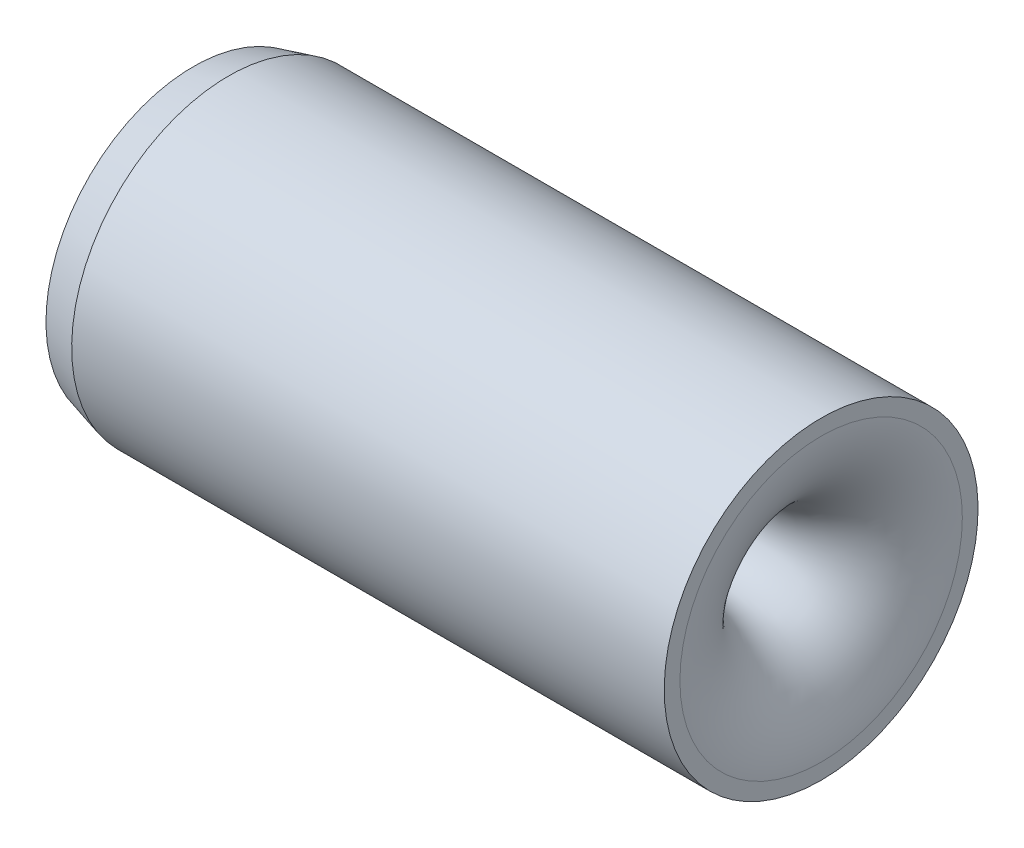
ISO-10303-21;
HEADER;
FILE_DESCRIPTION(('STEP AP214'),'2;1');
FILE_NAME('part.step','',(''),(''),'','','');
FILE_SCHEMA(('AUTOMOTIVE_DESIGN { 1 0 10303 214 1 1 1 1 }'));
ENDSEC;
DATA;
#1=APPLICATION_CONTEXT('core data for automotive mechanical design processes');
#2=APPLICATION_PROTOCOL_DEFINITION('international standard','automotive_design',2000,#1);
#3=PRODUCT_CONTEXT('',#1,'mechanical');
#4=PRODUCT('Part','Part','',(#3));
#5=PRODUCT_RELATED_PRODUCT_CATEGORY('part','',(#4));
#6=PRODUCT_DEFINITION_FORMATION('','',#4);
#7=PRODUCT_DEFINITION_CONTEXT('part definition',#1,'design');
#8=PRODUCT_DEFINITION('design','',#6,#7);
#9=PRODUCT_DEFINITION_SHAPE('','',#8);
#10=(LENGTH_UNIT() NAMED_UNIT(*) SI_UNIT(.MILLI.,.METRE.));
#11=(NAMED_UNIT(*) PLANE_ANGLE_UNIT() SI_UNIT($,.RADIAN.));
#12=(NAMED_UNIT(*) SI_UNIT($,.STERADIAN.) SOLID_ANGLE_UNIT());
#13=UNCERTAINTY_MEASURE_WITH_UNIT(LENGTH_MEASURE(1.E-05),#10,'distance_accuracy_value','');
#14=(GEOMETRIC_REPRESENTATION_CONTEXT(3) GLOBAL_UNCERTAINTY_ASSIGNED_CONTEXT((#13)) GLOBAL_UNIT_ASSIGNED_CONTEXT((#10,
#11,#12)) REPRESENTATION_CONTEXT('',''));
#15=CARTESIAN_POINT('',(0.,0.,0.));
#16=DIRECTION('',(0.,0.,1.));
#17=DIRECTION('',(1.,0.,0.));
#18=AXIS2_PLACEMENT_3D('',#15,#16,#17);
#19=CARTESIAN_POINT('',(2.,0.,0.));
#20=DIRECTION('',(-1.,0.,0.));
#21=DIRECTION('',(0.,-1.,0.));
#22=AXIS2_PLACEMENT_3D('',#19,#20,#21);
#23=TOROIDAL_SURFACE('',#22,1.35,1.);
#24=CARTESIAN_POINT('',(3.,0.,0.));
#25=DIRECTION('',(-1.,0.,0.));
#26=DIRECTION('',(0.,-1.,0.));
#27=AXIS2_PLACEMENT_3D('',#24,#25,#26);
#28=CIRCLE('',#27,1.35);
#29=CARTESIAN_POINT('',(3.,-1.35,0.));
#30=VERTEX_POINT('',#29);
#31=EDGE_CURVE('E10',#30,#30,#28,.T.);
#32=ORIENTED_EDGE('',*,*,#31,.F.);
#33=EDGE_LOOP('',(#32));
#34=FACE_BOUND('',#33,.T.);
#35=CARTESIAN_POINT('',(2.,0.,0.));
#36=DIRECTION('',(-1.,0.,0.));
#37=DIRECTION('',(0.,-1.,0.));
#38=AXIS2_PLACEMENT_3D('',#35,#36,#37);
#39=CIRCLE('',#38,0.349999999999999);
#40=CARTESIAN_POINT('',(2.,-0.349999999999998,0.));
#41=VERTEX_POINT('',#40);
#42=EDGE_CURVE('E56',#41,#41,#39,.T.);
#43=ORIENTED_EDGE('',*,*,#42,.T.);
#44=EDGE_LOOP('',(#43));
#45=FACE_BOUND('',#44,.T.);
#46=ADVANCED_FACE('F31',(#34,#45),#23,.T.);
#47=CARTESIAN_POINT('',(3.,1.5,0.));
#48=DIRECTION('',(-1.,0.,0.));
#49=DIRECTION('',(0.,-1.,0.));
#50=AXIS2_PLACEMENT_3D('',#47,#48,#49);
#51=PLANE('',#50);
#52=CARTESIAN_POINT('',(3.,0.,0.));
#53=DIRECTION('',(-1.,0.,0.));
#54=DIRECTION('',(0.,-1.,0.));
#55=AXIS2_PLACEMENT_3D('',#52,#53,#54);
#56=CIRCLE('',#55,1.5);
#57=CARTESIAN_POINT('',(3.,-1.5,0.));
#58=VERTEX_POINT('',#57);
#59=EDGE_CURVE('E37',#58,#58,#56,.T.);
#60=ORIENTED_EDGE('',*,*,#59,.F.);
#61=EDGE_LOOP('',(#60));
#62=FACE_BOUND('',#61,.T.);
#63=ORIENTED_EDGE('',*,*,#31,.T.);
#64=EDGE_LOOP('',(#63));
#65=FACE_BOUND('',#64,.T.);
#66=ADVANCED_FACE('F87',(#62,#65),#51,.F.);
#67=CARTESIAN_POINT('',(-3.,0.,0.));
#68=DIRECTION('',(-1.,0.,0.));
#69=DIRECTION('',(0.,-1.,0.));
#70=AXIS2_PLACEMENT_3D('',#67,#68,#69);
#71=CYLINDRICAL_SURFACE('',#70,1.5);
#72=CARTESIAN_POINT('',(-2.6641154273188,0.,0.));
#73=DIRECTION('',(-1.,0.,0.));
#74=DIRECTION('',(0.,-1.,0.));
#75=AXIS2_PLACEMENT_3D('',#72,#73,#74);
#76=CIRCLE('',#75,1.5);
#77=CARTESIAN_POINT('',(-2.6641154273188,-1.5,0.));
#78=VERTEX_POINT('',#77);
#79=EDGE_CURVE('E41',#78,#78,#76,.T.);
#80=ORIENTED_EDGE('',*,*,#79,.F.);
#81=EDGE_LOOP('',(#80));
#82=FACE_BOUND('',#81,.T.);
#83=ORIENTED_EDGE('',*,*,#59,.T.);
#84=EDGE_LOOP('',(#83));
#85=FACE_BOUND('',#84,.T.);
#86=ADVANCED_FACE('F82',(#82,#85),#71,.T.);
#87=CARTESIAN_POINT('',(-2.6641154273188,0.,0.));
#88=DIRECTION('',(1.,0.,0.));
#89=DIRECTION('',(0.,1.,0.));
#90=AXIS2_PLACEMENT_3D('',#87,#88,#89);
#91=CONICAL_SURFACE('',#90,1.5,0.26179938779915);
#92=CARTESIAN_POINT('',(-3.,0.,0.));
#93=DIRECTION('',(-1.,0.,0.));
#94=DIRECTION('',(0.,-1.,0.));
#95=AXIS2_PLACEMENT_3D('',#92,#93,#94);
#96=CIRCLE('',#95,1.41);
#97=CARTESIAN_POINT('',(-3.,-1.41,0.));
#98=VERTEX_POINT('',#97);
#99=EDGE_CURVE('E45',#98,#98,#96,.T.);
#100=ORIENTED_EDGE('',*,*,#99,.F.);
#101=EDGE_LOOP('',(#100));
#102=FACE_BOUND('',#101,.T.);
#103=ORIENTED_EDGE('',*,*,#79,.T.);
#104=EDGE_LOOP('',(#103));
#105=FACE_BOUND('',#104,.T.);
#106=ADVANCED_FACE('F76',(#102,#105),#91,.T.);
#107=CARTESIAN_POINT('',(-3.,1.41,0.));
#108=DIRECTION('',(1.,0.,0.));
#109=DIRECTION('',(0.,1.,0.));
#110=AXIS2_PLACEMENT_3D('',#107,#108,#109);
#111=PLANE('',#110);
#112=CARTESIAN_POINT('',(-3.,0.,0.));
#113=DIRECTION('',(-1.,0.,0.));
#114=DIRECTION('',(0.,-1.,0.));
#115=AXIS2_PLACEMENT_3D('',#112,#113,#114);
#116=CIRCLE('',#115,1.35);
#117=CARTESIAN_POINT('',(-3.,-1.35,0.));
#118=VERTEX_POINT('',#117);
#119=EDGE_CURVE('E50',#118,#118,#116,.T.);
#120=ORIENTED_EDGE('',*,*,#119,.F.);
#121=EDGE_LOOP('',(#120));
#122=FACE_BOUND('',#121,.T.);
#123=ORIENTED_EDGE('',*,*,#99,.T.);
#124=EDGE_LOOP('',(#123));
#125=FACE_BOUND('',#124,.T.);
#126=ADVANCED_FACE('F70',(#122,#125),#111,.F.);
#127=CARTESIAN_POINT('',(-2.,0.,0.));
#128=DIRECTION('',(-1.,0.,0.));
#129=DIRECTION('',(0.,-1.,0.));
#130=AXIS2_PLACEMENT_3D('',#127,#128,#129);
#131=TOROIDAL_SURFACE('',#130,1.35,1.);
#132=CARTESIAN_POINT('',(-2.,0.,0.));
#133=DIRECTION('',(-1.,0.,0.));
#134=DIRECTION('',(0.,-1.,0.));
#135=AXIS2_PLACEMENT_3D('',#132,#133,#134);
#136=CIRCLE('',#135,0.35);
#137=CARTESIAN_POINT('',(-2.,-0.35,0.));
#138=VERTEX_POINT('',#137);
#139=EDGE_CURVE('E53',#138,#138,#136,.T.);
#140=ORIENTED_EDGE('',*,*,#139,.F.);
#141=EDGE_LOOP('',(#140));
#142=FACE_BOUND('',#141,.T.);
#143=ORIENTED_EDGE('',*,*,#119,.T.);
#144=EDGE_LOOP('',(#143));
#145=FACE_BOUND('',#144,.T.);
#146=ADVANCED_FACE('F64',(#142,#145),#131,.T.);
#147=CARTESIAN_POINT('',(-3.,0.,0.));
#148=DIRECTION('',(-1.,0.,0.));
#149=DIRECTION('',(0.,-1.,0.));
#150=AXIS2_PLACEMENT_3D('',#147,#148,#149);
#151=CYLINDRICAL_SURFACE('',#150,0.35);
#152=ORIENTED_EDGE('',*,*,#42,.F.);
#153=EDGE_LOOP('',(#152));
#154=FACE_BOUND('',#153,.T.);
#155=ORIENTED_EDGE('',*,*,#139,.T.);
#156=EDGE_LOOP('',(#155));
#157=FACE_BOUND('',#156,.T.);
#158=ADVANCED_FACE('F61',(#154,#157),#151,.F.);
#159=CLOSED_SHELL('',(#46,#66,#86,#106,#126,#146,#158));
#160=MANIFOLD_SOLID_BREP('B2',#159);
#161=ADVANCED_BREP_SHAPE_REPRESENTATION('',(#18,#160),#14);
#162=SHAPE_DEFINITION_REPRESENTATION(#9,#161);
ENDSEC;
END-ISO-10303-21;
